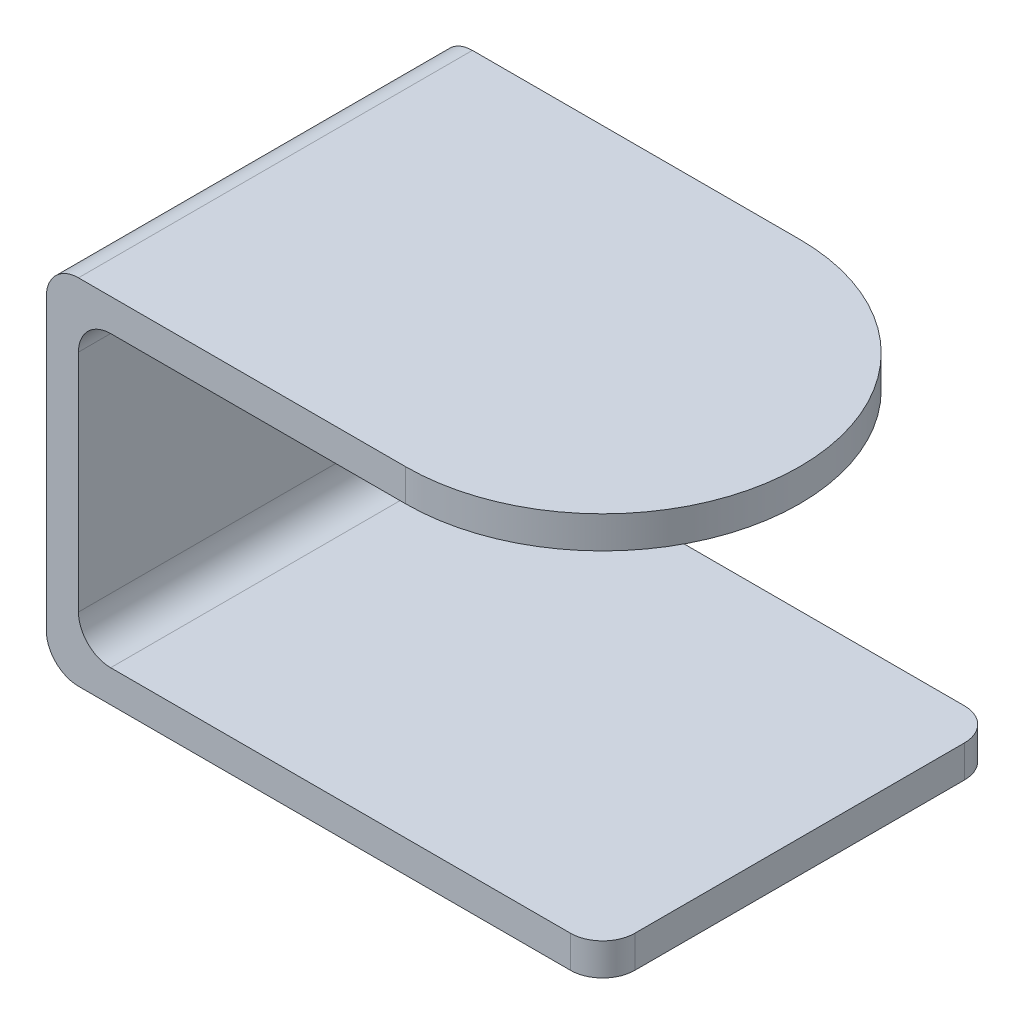
ISO-10303-21;
HEADER;
FILE_DESCRIPTION(('STEP AP214'),'2;1');
FILE_NAME('part.step','',(''),(''),'','','');
FILE_SCHEMA(('AUTOMOTIVE_DESIGN { 1 0 10303 214 1 1 1 1 }'));
ENDSEC;
DATA;
#1=APPLICATION_CONTEXT('core data for automotive mechanical design processes');
#2=APPLICATION_PROTOCOL_DEFINITION('international standard','automotive_design',2000,#1);
#3=PRODUCT_CONTEXT('',#1,'mechanical');
#4=PRODUCT('Part','Part','',(#3));
#5=PRODUCT_RELATED_PRODUCT_CATEGORY('part','',(#4));
#6=PRODUCT_DEFINITION_FORMATION('','',#4);
#7=PRODUCT_DEFINITION_CONTEXT('part definition',#1,'design');
#8=PRODUCT_DEFINITION('design','',#6,#7);
#9=PRODUCT_DEFINITION_SHAPE('','',#8);
#10=(LENGTH_UNIT() NAMED_UNIT(*) SI_UNIT(.MILLI.,.METRE.));
#11=(NAMED_UNIT(*) PLANE_ANGLE_UNIT() SI_UNIT($,.RADIAN.));
#12=(NAMED_UNIT(*) SI_UNIT($,.STERADIAN.) SOLID_ANGLE_UNIT());
#13=UNCERTAINTY_MEASURE_WITH_UNIT(LENGTH_MEASURE(1.E-05),#10,'distance_accuracy_value','');
#14=(GEOMETRIC_REPRESENTATION_CONTEXT(3) GLOBAL_UNCERTAINTY_ASSIGNED_CONTEXT((#13)) GLOBAL_UNIT_ASSIGNED_CONTEXT((#10,
#11,#12)) REPRESENTATION_CONTEXT('',''));
#15=CARTESIAN_POINT('',(0.,0.,0.));
#16=DIRECTION('',(0.,0.,1.));
#17=DIRECTION('',(1.,0.,0.));
#18=AXIS2_PLACEMENT_3D('',#15,#16,#17);
#19=CARTESIAN_POINT('',(-6.125,10.,6.125));
#20=DIRECTION('',(0.,1.,0.));
#21=DIRECTION('',(0.,0.,1.));
#22=AXIS2_PLACEMENT_3D('',#19,#20,#21);
#23=CYLINDRICAL_SURFACE('',#22,6.125);
#24=DIRECTION('',(0.,1.,0.));
#25=VECTOR('',#24,1.);
#26=CARTESIAN_POINT('',(-6.125,0.,12.25));
#27=LINE('',#26,#25);
#28=CARTESIAN_POINT('',(-6.125,10.,12.25));
#29=VERTEX_POINT('',#28);
#30=CARTESIAN_POINT('',(-6.125,11.,12.25));
#31=VERTEX_POINT('',#30);
#32=EDGE_CURVE('E153',#29,#31,#27,.T.);
#33=ORIENTED_EDGE('',*,*,#32,.F.);
#34=CARTESIAN_POINT('',(-6.125,10.,6.125));
#35=DIRECTION('',(0.,1.,0.));
#36=DIRECTION('',(0.,0.,1.));
#37=AXIS2_PLACEMENT_3D('',#34,#35,#36);
#38=CIRCLE('',#37,6.125);
#39=CARTESIAN_POINT('',(-6.125,10.,0.));
#40=VERTEX_POINT('',#39);
#41=EDGE_CURVE('E165',#40,#29,#38,.F.);
#42=ORIENTED_EDGE('',*,*,#41,.F.);
#43=DIRECTION('',(0.,-1.,0.));
#44=VECTOR('',#43,1.);
#45=CARTESIAN_POINT('',(-6.125,10.,0.));
#46=LINE('',#45,#44);
#47=CARTESIAN_POINT('',(-6.125,11.,0.));
#48=VERTEX_POINT('',#47);
#49=EDGE_CURVE('E174',#48,#40,#46,.T.);
#50=ORIENTED_EDGE('',*,*,#49,.F.);
#51=CARTESIAN_POINT('',(-6.125,11.,6.125));
#52=DIRECTION('',(0.,-1.,0.));
#53=DIRECTION('',(0.,0.,-1.));
#54=AXIS2_PLACEMENT_3D('',#51,#52,#53);
#55=CIRCLE('',#54,6.125);
#56=EDGE_CURVE('E173',#31,#48,#55,.F.);
#57=ORIENTED_EDGE('',*,*,#56,.F.);
#58=EDGE_LOOP('',(#33,#42,#50,#57));
#59=FACE_BOUND('',#58,.T.);
#60=ADVANCED_FACE('F44',(#59),#23,.T.);
#61=CARTESIAN_POINT('',(0.,1.,12.25));
#62=DIRECTION('',(-1.,0.,0.));
#63=DIRECTION('',(0.,0.,1.));
#64=AXIS2_PLACEMENT_3D('',#61,#62,#63);
#65=PLANE('',#64);
#66=DIRECTION('',(0.,0.,-1.));
#67=VECTOR('',#66,1.);
#68=CARTESIAN_POINT('',(0.,0.,12.25));
#69=LINE('',#68,#67);
#70=CARTESIAN_POINT('',(0.,0.,11.25));
#71=VERTEX_POINT('',#70);
#72=CARTESIAN_POINT('',(0.,0.,1.));
#73=VERTEX_POINT('',#72);
#74=EDGE_CURVE('E182',#71,#73,#69,.T.);
#75=ORIENTED_EDGE('',*,*,#74,.T.);
#76=DIRECTION('',(0.,1.,0.));
#77=VECTOR('',#76,1.);
#78=CARTESIAN_POINT('',(0.,1.,1.));
#79=LINE('',#78,#77);
#80=CARTESIAN_POINT('',(0.,1.,1.));
#81=VERTEX_POINT('',#80);
#82=EDGE_CURVE('E247',#73,#81,#79,.T.);
#83=ORIENTED_EDGE('',*,*,#82,.T.);
#84=DIRECTION('',(0.,0.,-1.));
#85=VECTOR('',#84,1.);
#86=CARTESIAN_POINT('',(0.,1.,12.25));
#87=LINE('',#86,#85);
#88=CARTESIAN_POINT('',(0.,1.,11.25));
#89=VERTEX_POINT('',#88);
#90=EDGE_CURVE('E177',#89,#81,#87,.T.);
#91=ORIENTED_EDGE('',*,*,#90,.F.);
#92=DIRECTION('',(0.,1.,0.));
#93=VECTOR('',#92,1.);
#94=CARTESIAN_POINT('',(0.,1.,11.25));
#95=LINE('',#94,#93);
#96=EDGE_CURVE('E244',#89,#71,#95,.F.);
#97=ORIENTED_EDGE('',*,*,#96,.T.);
#98=EDGE_LOOP('',(#75,#83,#91,#97));
#99=FACE_BOUND('',#98,.T.);
#100=ADVANCED_FACE('F287',(#99),#65,.F.);
#101=CARTESIAN_POINT('',(0.,1.,12.25));
#102=DIRECTION('',(0.,-1.,0.));
#103=DIRECTION('',(0.,0.,-1.));
#104=AXIS2_PLACEMENT_3D('',#101,#102,#103);
#105=PLANE('',#104);
#106=DIRECTION('',(-1.,0.,0.));
#107=VECTOR('',#106,1.);
#108=CARTESIAN_POINT('',(0.,1.,0.));
#109=LINE('',#108,#107);
#110=CARTESIAN_POINT('',(-1.,1.,0.));
#111=VERTEX_POINT('',#110);
#112=CARTESIAN_POINT('',(-15.3,1.,0.));
#113=VERTEX_POINT('',#112);
#114=EDGE_CURVE('E269',#111,#113,#109,.T.);
#115=ORIENTED_EDGE('',*,*,#114,.T.);
#116=DIRECTION('',(0.,0.,-1.));
#117=VECTOR('',#116,1.);
#118=CARTESIAN_POINT('',(-15.3,1.,12.25));
#119=LINE('',#118,#117);
#120=CARTESIAN_POINT('',(-15.3,1.,12.25));
#121=VERTEX_POINT('',#120);
#122=EDGE_CURVE('E235',#113,#121,#119,.F.);
#123=ORIENTED_EDGE('',*,*,#122,.T.);
#124=DIRECTION('',(-1.,0.,0.));
#125=VECTOR('',#124,1.);
#126=CARTESIAN_POINT('',(0.,1.,12.25));
#127=LINE('',#126,#125);
#128=CARTESIAN_POINT('',(-1.,1.,12.25));
#129=VERTEX_POINT('',#128);
#130=EDGE_CURVE('E343',#129,#121,#127,.T.);
#131=ORIENTED_EDGE('',*,*,#130,.F.);
#132=CARTESIAN_POINT('',(-1.,1.,11.25));
#133=DIRECTION('',(0.,-1.,0.));
#134=DIRECTION('',(0.,0.,-1.));
#135=AXIS2_PLACEMENT_3D('',#132,#133,#134);
#136=CIRCLE('',#135,1.);
#137=EDGE_CURVE('E68',#129,#89,#136,.F.);
#138=ORIENTED_EDGE('',*,*,#137,.T.);
#139=ORIENTED_EDGE('',*,*,#90,.T.);
#140=CARTESIAN_POINT('',(-1.,1.,1.));
#141=DIRECTION('',(0.,-1.,0.));
#142=DIRECTION('',(0.,0.,-1.));
#143=AXIS2_PLACEMENT_3D('',#140,#141,#142);
#144=CIRCLE('',#143,1.);
#145=EDGE_CURVE('E60',#81,#111,#144,.F.);
#146=ORIENTED_EDGE('',*,*,#145,.T.);
#147=EDGE_LOOP('',(#115,#123,#131,#138,#139,#146));
#148=FACE_BOUND('',#147,.T.);
#149=ADVANCED_FACE('F292',(#148),#105,.F.);
#150=CARTESIAN_POINT('',(-16.3,1.,12.25));
#151=DIRECTION('',(-1.,0.,0.));
#152=DIRECTION('',(0.,0.,1.));
#153=AXIS2_PLACEMENT_3D('',#150,#151,#152);
#154=PLANE('',#153);
#155=DIRECTION('',(0.,1.,0.));
#156=VECTOR('',#155,1.);
#157=CARTESIAN_POINT('',(-16.3,1.,12.25));
#158=LINE('',#157,#156);
#159=CARTESIAN_POINT('',(-16.3,2.,12.25));
#160=VERTEX_POINT('',#159);
#161=CARTESIAN_POINT('',(-16.3,9.,12.25));
#162=VERTEX_POINT('',#161);
#163=EDGE_CURVE('E162',#160,#162,#158,.T.);
#164=ORIENTED_EDGE('',*,*,#163,.F.);
#165=DIRECTION('',(0.,0.,-1.));
#166=VECTOR('',#165,1.);
#167=CARTESIAN_POINT('',(-16.3,2.,0.));
#168=LINE('',#167,#166);
#169=CARTESIAN_POINT('',(-16.3,2.,0.));
#170=VERTEX_POINT('',#169);
#171=EDGE_CURVE('E227',#160,#170,#168,.T.);
#172=ORIENTED_EDGE('',*,*,#171,.T.);
#173=DIRECTION('',(0.,1.,0.));
#174=VECTOR('',#173,1.);
#175=CARTESIAN_POINT('',(-16.3,1.,0.));
#176=LINE('',#175,#174);
#177=CARTESIAN_POINT('',(-16.3,9.,0.));
#178=VERTEX_POINT('',#177);
#179=EDGE_CURVE('E261',#170,#178,#176,.T.);
#180=ORIENTED_EDGE('',*,*,#179,.T.);
#181=DIRECTION('',(0.,0.,-1.));
#182=VECTOR('',#181,1.);
#183=CARTESIAN_POINT('',(-16.3,9.,12.25));
#184=LINE('',#183,#182);
#185=EDGE_CURVE('E224',#178,#162,#184,.F.);
#186=ORIENTED_EDGE('',*,*,#185,.T.);
#187=EDGE_LOOP('',(#164,#172,#180,#186));
#188=FACE_BOUND('',#187,.T.);
#189=ADVANCED_FACE('F266',(#188),#154,.F.);
#190=CARTESIAN_POINT('',(-16.3,10.,12.25));
#191=DIRECTION('',(0.,1.,0.));
#192=DIRECTION('',(0.,0.,1.));
#193=AXIS2_PLACEMENT_3D('',#190,#191,#192);
#194=PLANE('',#193);
#195=DIRECTION('',(1.,0.,0.));
#196=VECTOR('',#195,1.);
#197=CARTESIAN_POINT('',(-16.3,10.,12.25));
#198=LINE('',#197,#196);
#199=CARTESIAN_POINT('',(-15.3,10.,12.25));
#200=VERTEX_POINT('',#199);
#201=EDGE_CURVE('E147',#200,#29,#198,.T.);
#202=ORIENTED_EDGE('',*,*,#201,.F.);
#203=DIRECTION('',(0.,0.,-1.));
#204=VECTOR('',#203,1.);
#205=CARTESIAN_POINT('',(-15.3,10.,0.));
#206=LINE('',#205,#204);
#207=CARTESIAN_POINT('',(-15.3,10.,0.));
#208=VERTEX_POINT('',#207);
#209=EDGE_CURVE('E238',#200,#208,#206,.T.);
#210=ORIENTED_EDGE('',*,*,#209,.T.);
#211=DIRECTION('',(1.,0.,0.));
#212=VECTOR('',#211,1.);
#213=CARTESIAN_POINT('',(-16.3,10.,0.));
#214=LINE('',#213,#212);
#215=EDGE_CURVE('E168',#208,#40,#214,.T.);
#216=ORIENTED_EDGE('',*,*,#215,.T.);
#217=ORIENTED_EDGE('',*,*,#41,.T.);
#218=EDGE_LOOP('',(#202,#210,#216,#217));
#219=FACE_BOUND('',#218,.T.);
#220=ADVANCED_FACE('F166',(#219),#194,.F.);
#221=CARTESIAN_POINT('',(-17.3,11.,12.25));
#222=DIRECTION('',(0.,-1.,0.));
#223=DIRECTION('',(0.,0.,-1.));
#224=AXIS2_PLACEMENT_3D('',#221,#222,#223);
#225=PLANE('',#224);
#226=DIRECTION('',(-1.,0.,0.));
#227=VECTOR('',#226,1.);
#228=CARTESIAN_POINT('',(-17.3,11.,0.));
#229=LINE('',#228,#227);
#230=CARTESIAN_POINT('',(-16.3,11.,0.));
#231=VERTEX_POINT('',#230);
#232=EDGE_CURVE('E333',#48,#231,#229,.T.);
#233=ORIENTED_EDGE('',*,*,#232,.T.);
#234=DIRECTION('',(0.,0.,-1.));
#235=VECTOR('',#234,1.);
#236=CARTESIAN_POINT('',(-16.3,11.,12.25));
#237=LINE('',#236,#235);
#238=CARTESIAN_POINT('',(-16.3,11.,12.25));
#239=VERTEX_POINT('',#238);
#240=EDGE_CURVE('E241',#231,#239,#237,.F.);
#241=ORIENTED_EDGE('',*,*,#240,.T.);
#242=DIRECTION('',(-1.,0.,0.));
#243=VECTOR('',#242,1.);
#244=CARTESIAN_POINT('',(-17.3,11.,12.25));
#245=LINE('',#244,#243);
#246=EDGE_CURVE('E161',#31,#239,#245,.T.);
#247=ORIENTED_EDGE('',*,*,#246,.F.);
#248=ORIENTED_EDGE('',*,*,#56,.T.);
#249=EDGE_LOOP('',(#233,#241,#247,#248));
#250=FACE_BOUND('',#249,.T.);
#251=ADVANCED_FACE('F372',(#250),#225,.F.);
#252=CARTESIAN_POINT('',(-17.3,0.,12.25));
#253=DIRECTION('',(1.,0.,0.));
#254=DIRECTION('',(0.,0.,-1.));
#255=AXIS2_PLACEMENT_3D('',#252,#253,#254);
#256=PLANE('',#255);
#257=DIRECTION('',(0.,-1.,0.));
#258=VECTOR('',#257,1.);
#259=CARTESIAN_POINT('',(-17.3,0.,0.));
#260=LINE('',#259,#258);
#261=CARTESIAN_POINT('',(-17.3,10.,0.));
#262=VERTEX_POINT('',#261);
#263=CARTESIAN_POINT('',(-17.3,1.,0.));
#264=VERTEX_POINT('',#263);
#265=EDGE_CURVE('E337',#262,#264,#260,.T.);
#266=ORIENTED_EDGE('',*,*,#265,.T.);
#267=DIRECTION('',(0.,0.,-1.));
#268=VECTOR('',#267,1.);
#269=CARTESIAN_POINT('',(-17.3,1.,12.25));
#270=LINE('',#269,#268);
#271=CARTESIAN_POINT('',(-17.3,1.,12.25));
#272=VERTEX_POINT('',#271);
#273=EDGE_CURVE('E211',#264,#272,#270,.F.);
#274=ORIENTED_EDGE('',*,*,#273,.T.);
#275=DIRECTION('',(0.,-1.,0.));
#276=VECTOR('',#275,1.);
#277=CARTESIAN_POINT('',(-17.3,0.,12.25));
#278=LINE('',#277,#276);
#279=CARTESIAN_POINT('',(-17.3,10.,12.25));
#280=VERTEX_POINT('',#279);
#281=EDGE_CURVE('E314',#280,#272,#278,.T.);
#282=ORIENTED_EDGE('',*,*,#281,.F.);
#283=DIRECTION('',(0.,0.,-1.));
#284=VECTOR('',#283,1.);
#285=CARTESIAN_POINT('',(-17.3,10.,12.25));
#286=LINE('',#285,#284);
#287=EDGE_CURVE('E207',#280,#262,#286,.T.);
#288=ORIENTED_EDGE('',*,*,#287,.T.);
#289=EDGE_LOOP('',(#266,#274,#282,#288));
#290=FACE_BOUND('',#289,.T.);
#291=ADVANCED_FACE('F358',(#290),#256,.F.);
#292=CARTESIAN_POINT('',(0.,0.,12.25));
#293=DIRECTION('',(0.,1.,0.));
#294=DIRECTION('',(0.,0.,1.));
#295=AXIS2_PLACEMENT_3D('',#292,#293,#294);
#296=PLANE('',#295);
#297=DIRECTION('',(1.,0.,0.));
#298=VECTOR('',#297,1.);
#299=CARTESIAN_POINT('',(0.,0.,12.25));
#300=LINE('',#299,#298);
#301=CARTESIAN_POINT('',(-16.3,0.,12.25));
#302=VERTEX_POINT('',#301);
#303=CARTESIAN_POINT('',(-1.,0.,12.25));
#304=VERTEX_POINT('',#303);
#305=EDGE_CURVE('E311',#302,#304,#300,.T.);
#306=ORIENTED_EDGE('',*,*,#305,.F.);
#307=DIRECTION('',(0.,0.,-1.));
#308=VECTOR('',#307,1.);
#309=CARTESIAN_POINT('',(-16.3,0.,12.25));
#310=LINE('',#309,#308);
#311=CARTESIAN_POINT('',(-16.3,0.,0.));
#312=VERTEX_POINT('',#311);
#313=EDGE_CURVE('E194',#302,#312,#310,.T.);
#314=ORIENTED_EDGE('',*,*,#313,.T.);
#315=DIRECTION('',(1.,0.,0.));
#316=VECTOR('',#315,1.);
#317=CARTESIAN_POINT('',(0.,0.,0.));
#318=LINE('',#317,#316);
#319=CARTESIAN_POINT('',(-1.,0.,0.));
#320=VERTEX_POINT('',#319);
#321=EDGE_CURVE('E341',#312,#320,#318,.T.);
#322=ORIENTED_EDGE('',*,*,#321,.T.);
#323=CARTESIAN_POINT('',(-1.,0.,1.));
#324=DIRECTION('',(0.,1.,0.));
#325=DIRECTION('',(0.,0.,1.));
#326=AXIS2_PLACEMENT_3D('',#323,#324,#325);
#327=CIRCLE('',#326,1.);
#328=EDGE_CURVE('E191',#320,#73,#327,.F.);
#329=ORIENTED_EDGE('',*,*,#328,.T.);
#330=ORIENTED_EDGE('',*,*,#74,.F.);
#331=CARTESIAN_POINT('',(-1.,0.,11.25));
#332=DIRECTION('',(0.,1.,0.));
#333=DIRECTION('',(0.,0.,1.));
#334=AXIS2_PLACEMENT_3D('',#331,#332,#333);
#335=CIRCLE('',#334,1.);
#336=EDGE_CURVE('E188',#71,#304,#335,.F.);
#337=ORIENTED_EDGE('',*,*,#336,.T.);
#338=EDGE_LOOP('',(#306,#314,#322,#329,#330,#337));
#339=FACE_BOUND('',#338,.T.);
#340=ADVANCED_FACE('F316',(#339),#296,.F.);
#341=CARTESIAN_POINT('',(0.,0.,12.25));
#342=DIRECTION('',(0.,0.,-1.));
#343=DIRECTION('',(-1.,0.,0.));
#344=AXIS2_PLACEMENT_3D('',#341,#342,#343);
#345=PLANE('',#344);
#346=ORIENTED_EDGE('',*,*,#281,.T.);
#347=CARTESIAN_POINT('',(-16.3,1.,12.25));
#348=DIRECTION('',(0.,0.,-1.));
#349=DIRECTION('',(-1.,0.,0.));
#350=AXIS2_PLACEMENT_3D('',#347,#348,#349);
#351=CIRCLE('',#350,1.);
#352=EDGE_CURVE('E221',#272,#302,#351,.F.);
#353=ORIENTED_EDGE('',*,*,#352,.T.);
#354=ORIENTED_EDGE('',*,*,#305,.T.);
#355=DIRECTION('',(0.,1.,0.));
#356=VECTOR('',#355,1.);
#357=CARTESIAN_POINT('',(-1.,0.,12.25));
#358=LINE('',#357,#356);
#359=EDGE_CURVE('E214',#304,#129,#358,.T.);
#360=ORIENTED_EDGE('',*,*,#359,.T.);
#361=ORIENTED_EDGE('',*,*,#130,.T.);
#362=CARTESIAN_POINT('',(-15.3,2.,12.25));
#363=DIRECTION('',(0.,0.,-1.));
#364=DIRECTION('',(-1.,0.,0.));
#365=AXIS2_PLACEMENT_3D('',#362,#363,#364);
#366=CIRCLE('',#365,1.);
#367=EDGE_CURVE('E253',#121,#160,#366,.T.);
#368=ORIENTED_EDGE('',*,*,#367,.T.);
#369=ORIENTED_EDGE('',*,*,#163,.T.);
#370=CARTESIAN_POINT('',(-15.3,9.,12.25));
#371=DIRECTION('',(0.,0.,-1.));
#372=DIRECTION('',(-1.,0.,0.));
#373=AXIS2_PLACEMENT_3D('',#370,#371,#372);
#374=CIRCLE('',#373,1.);
#375=EDGE_CURVE('E11',#162,#200,#374,.T.);
#376=ORIENTED_EDGE('',*,*,#375,.T.);
#377=ORIENTED_EDGE('',*,*,#201,.T.);
#378=ORIENTED_EDGE('',*,*,#32,.T.);
#379=ORIENTED_EDGE('',*,*,#246,.T.);
#380=CARTESIAN_POINT('',(-16.3,10.,12.25));
#381=DIRECTION('',(0.,0.,-1.));
#382=DIRECTION('',(-1.,0.,0.));
#383=AXIS2_PLACEMENT_3D('',#380,#381,#382);
#384=CIRCLE('',#383,1.);
#385=EDGE_CURVE('E218',#239,#280,#384,.F.);
#386=ORIENTED_EDGE('',*,*,#385,.T.);
#387=EDGE_LOOP('',(#346,#353,#354,#360,#361,#368,#369,#376,#377,#378,#379,#386));
#388=FACE_BOUND('',#387,.T.);
#389=ADVANCED_FACE('F150',(#388),#345,.F.);
#390=CARTESIAN_POINT('',(0.,0.,0.));
#391=DIRECTION('',(0.,0.,-1.));
#392=DIRECTION('',(-1.,0.,0.));
#393=AXIS2_PLACEMENT_3D('',#390,#391,#392);
#394=PLANE('',#393);
#395=ORIENTED_EDGE('',*,*,#321,.F.);
#396=CARTESIAN_POINT('',(-16.3,1.,0.));
#397=DIRECTION('',(0.,0.,-1.));
#398=DIRECTION('',(-1.,0.,0.));
#399=AXIS2_PLACEMENT_3D('',#396,#397,#398);
#400=CIRCLE('',#399,1.);
#401=EDGE_CURVE('E204',#312,#264,#400,.T.);
#402=ORIENTED_EDGE('',*,*,#401,.T.);
#403=ORIENTED_EDGE('',*,*,#265,.F.);
#404=CARTESIAN_POINT('',(-16.3,10.,0.));
#405=DIRECTION('',(0.,0.,-1.));
#406=DIRECTION('',(-1.,0.,0.));
#407=AXIS2_PLACEMENT_3D('',#404,#405,#406);
#408=CIRCLE('',#407,1.);
#409=EDGE_CURVE('E201',#262,#231,#408,.T.);
#410=ORIENTED_EDGE('',*,*,#409,.T.);
#411=ORIENTED_EDGE('',*,*,#232,.F.);
#412=ORIENTED_EDGE('',*,*,#49,.T.);
#413=ORIENTED_EDGE('',*,*,#215,.F.);
#414=CARTESIAN_POINT('',(-15.3,9.,0.));
#415=DIRECTION('',(0.,0.,-1.));
#416=DIRECTION('',(-1.,0.,0.));
#417=AXIS2_PLACEMENT_3D('',#414,#415,#416);
#418=CIRCLE('',#417,1.);
#419=EDGE_CURVE('E53',#208,#178,#418,.F.);
#420=ORIENTED_EDGE('',*,*,#419,.T.);
#421=ORIENTED_EDGE('',*,*,#179,.F.);
#422=CARTESIAN_POINT('',(-15.3,2.,0.));
#423=DIRECTION('',(0.,0.,-1.));
#424=DIRECTION('',(-1.,0.,0.));
#425=AXIS2_PLACEMENT_3D('',#422,#423,#424);
#426=CIRCLE('',#425,1.);
#427=EDGE_CURVE('E250',#170,#113,#426,.F.);
#428=ORIENTED_EDGE('',*,*,#427,.T.);
#429=ORIENTED_EDGE('',*,*,#114,.F.);
#430=DIRECTION('',(0.,1.,0.));
#431=VECTOR('',#430,1.);
#432=CARTESIAN_POINT('',(-1.,0.,0.));
#433=LINE('',#432,#431);
#434=EDGE_CURVE('E198',#111,#320,#433,.F.);
#435=ORIENTED_EDGE('',*,*,#434,.T.);
#436=EDGE_LOOP('',(#395,#402,#403,#410,#411,#412,#413,#420,#421,#428,#429,#435));
#437=FACE_BOUND('',#436,.T.);
#438=ADVANCED_FACE('F260',(#437),#394,.T.);
#439=CARTESIAN_POINT('',(-16.3,1.,12.25));
#440=DIRECTION('',(0.,0.,-1.));
#441=DIRECTION('',(-1.,0.,0.));
#442=AXIS2_PLACEMENT_3D('',#439,#440,#441);
#443=CYLINDRICAL_SURFACE('',#442,1.);
#444=ORIENTED_EDGE('',*,*,#352,.F.);
#445=ORIENTED_EDGE('',*,*,#273,.F.);
#446=ORIENTED_EDGE('',*,*,#401,.F.);
#447=ORIENTED_EDGE('',*,*,#313,.F.);
#448=EDGE_LOOP('',(#444,#445,#446,#447));
#449=FACE_BOUND('',#448,.T.);
#450=ADVANCED_FACE('F283',(#449),#443,.T.);
#451=CARTESIAN_POINT('',(-15.3,2.,12.25));
#452=DIRECTION('',(0.,0.,1.));
#453=DIRECTION('',(1.,0.,0.));
#454=AXIS2_PLACEMENT_3D('',#451,#452,#453);
#455=CYLINDRICAL_SURFACE('',#454,1.);
#456=ORIENTED_EDGE('',*,*,#367,.F.);
#457=ORIENTED_EDGE('',*,*,#122,.F.);
#458=ORIENTED_EDGE('',*,*,#427,.F.);
#459=ORIENTED_EDGE('',*,*,#171,.F.);
#460=EDGE_LOOP('',(#456,#457,#458,#459));
#461=FACE_BOUND('',#460,.T.);
#462=ADVANCED_FACE('F274',(#461),#455,.F.);
#463=CARTESIAN_POINT('',(-15.3,9.,12.25));
#464=DIRECTION('',(0.,0.,1.));
#465=DIRECTION('',(1.,0.,0.));
#466=AXIS2_PLACEMENT_3D('',#463,#464,#465);
#467=CYLINDRICAL_SURFACE('',#466,1.);
#468=ORIENTED_EDGE('',*,*,#375,.F.);
#469=ORIENTED_EDGE('',*,*,#185,.F.);
#470=ORIENTED_EDGE('',*,*,#419,.F.);
#471=ORIENTED_EDGE('',*,*,#209,.F.);
#472=EDGE_LOOP('',(#468,#469,#470,#471));
#473=FACE_BOUND('',#472,.T.);
#474=ADVANCED_FACE('F271',(#473),#467,.F.);
#475=CARTESIAN_POINT('',(-16.3,10.,12.25));
#476=DIRECTION('',(0.,0.,-1.));
#477=DIRECTION('',(-1.,0.,0.));
#478=AXIS2_PLACEMENT_3D('',#475,#476,#477);
#479=CYLINDRICAL_SURFACE('',#478,1.);
#480=ORIENTED_EDGE('',*,*,#385,.F.);
#481=ORIENTED_EDGE('',*,*,#240,.F.);
#482=ORIENTED_EDGE('',*,*,#409,.F.);
#483=ORIENTED_EDGE('',*,*,#287,.F.);
#484=EDGE_LOOP('',(#480,#481,#482,#483));
#485=FACE_BOUND('',#484,.T.);
#486=ADVANCED_FACE('F273',(#485),#479,.T.);
#487=CARTESIAN_POINT('',(-1.,1.,1.));
#488=DIRECTION('',(0.,-1.,0.));
#489=DIRECTION('',(0.,0.,-1.));
#490=AXIS2_PLACEMENT_3D('',#487,#488,#489);
#491=CYLINDRICAL_SURFACE('',#490,1.);
#492=ORIENTED_EDGE('',*,*,#328,.F.);
#493=ORIENTED_EDGE('',*,*,#434,.F.);
#494=ORIENTED_EDGE('',*,*,#145,.F.);
#495=ORIENTED_EDGE('',*,*,#82,.F.);
#496=EDGE_LOOP('',(#492,#493,#494,#495));
#497=FACE_BOUND('',#496,.T.);
#498=ADVANCED_FACE('F280',(#497),#491,.T.);
#499=CARTESIAN_POINT('',(-1.,0.,11.25));
#500=DIRECTION('',(0.,1.,0.));
#501=DIRECTION('',(0.,0.,1.));
#502=AXIS2_PLACEMENT_3D('',#499,#500,#501);
#503=CYLINDRICAL_SURFACE('',#502,1.);
#504=ORIENTED_EDGE('',*,*,#336,.F.);
#505=ORIENTED_EDGE('',*,*,#96,.F.);
#506=ORIENTED_EDGE('',*,*,#137,.F.);
#507=ORIENTED_EDGE('',*,*,#359,.F.);
#508=EDGE_LOOP('',(#504,#505,#506,#507));
#509=FACE_BOUND('',#508,.T.);
#510=ADVANCED_FACE('F46',(#509),#503,.T.);
#511=CLOSED_SHELL('',(#60,#100,#149,#189,#220,#251,#291,#340,#389,#438,#450,#462,#474,#486,#498,#510));
#512=MANIFOLD_SOLID_BREP('B2',#511);
#513=ADVANCED_BREP_SHAPE_REPRESENTATION('',(#18,#512),#14);
#514=SHAPE_DEFINITION_REPRESENTATION(#9,#513);
ENDSEC;
END-ISO-10303-21;
